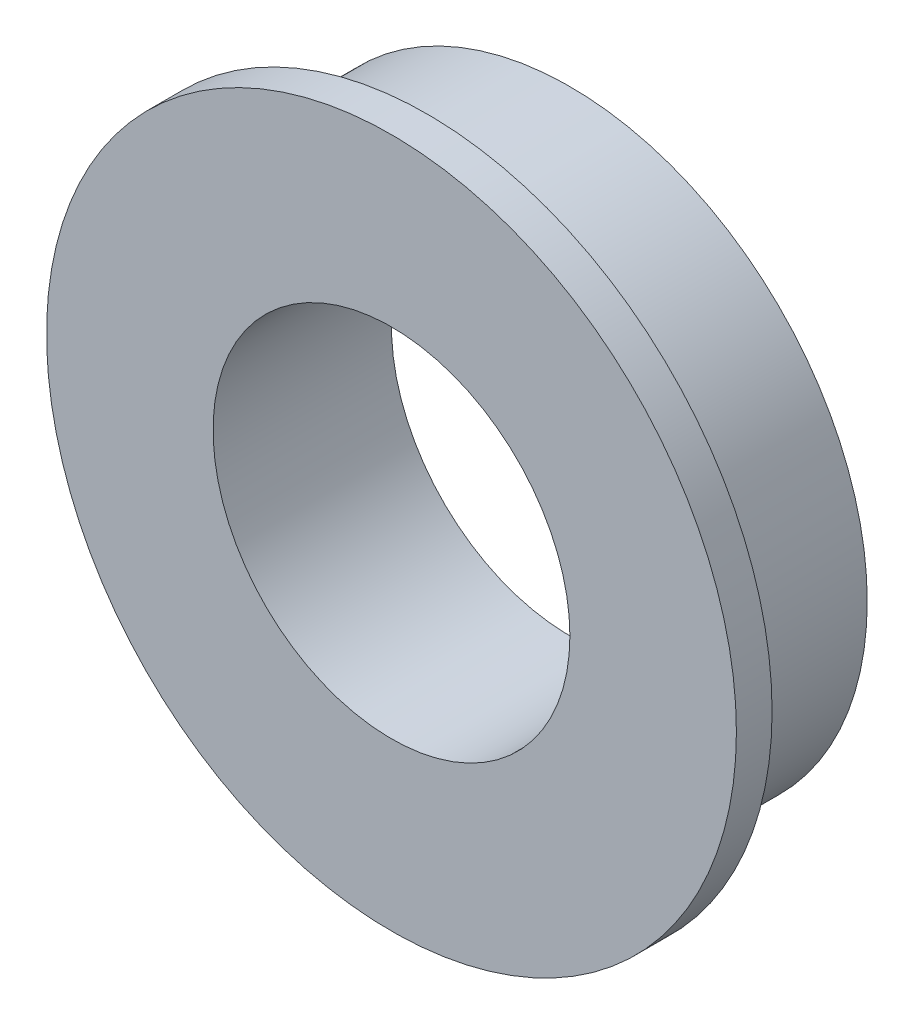
ISO-10303-21;
HEADER;
FILE_DESCRIPTION(('STEP AP214'),'2;1');
FILE_NAME('part.step','',(''),(''),'','','');
FILE_SCHEMA(('AUTOMOTIVE_DESIGN { 1 0 10303 214 1 1 1 1 }'));
ENDSEC;
DATA;
#1=APPLICATION_CONTEXT('core data for automotive mechanical design processes');
#2=APPLICATION_PROTOCOL_DEFINITION('international standard','automotive_design',2000,#1);
#3=PRODUCT_CONTEXT('',#1,'mechanical');
#4=PRODUCT('Part','Part','',(#3));
#5=PRODUCT_RELATED_PRODUCT_CATEGORY('part','',(#4));
#6=PRODUCT_DEFINITION_FORMATION('','',#4);
#7=PRODUCT_DEFINITION_CONTEXT('part definition',#1,'design');
#8=PRODUCT_DEFINITION('design','',#6,#7);
#9=PRODUCT_DEFINITION_SHAPE('','',#8);
#10=(LENGTH_UNIT() NAMED_UNIT(*) SI_UNIT(.MILLI.,.METRE.));
#11=(NAMED_UNIT(*) PLANE_ANGLE_UNIT() SI_UNIT($,.RADIAN.));
#12=(NAMED_UNIT(*) SI_UNIT($,.STERADIAN.) SOLID_ANGLE_UNIT());
#13=UNCERTAINTY_MEASURE_WITH_UNIT(LENGTH_MEASURE(1.E-05),#10,'distance_accuracy_value','');
#14=(GEOMETRIC_REPRESENTATION_CONTEXT(3) GLOBAL_UNCERTAINTY_ASSIGNED_CONTEXT((#13)) GLOBAL_UNIT_ASSIGNED_CONTEXT((#10,
#11,#12)) REPRESENTATION_CONTEXT('',''));
#15=CARTESIAN_POINT('',(0.,0.,0.));
#16=DIRECTION('',(0.,0.,1.));
#17=DIRECTION('',(1.,0.,0.));
#18=AXIS2_PLACEMENT_3D('',#15,#16,#17);
#19=CARTESIAN_POINT('',(0.,0.,3.));
#20=DIRECTION('',(0.,0.,-1.));
#21=DIRECTION('',(-1.,0.,0.));
#22=AXIS2_PLACEMENT_3D('',#19,#20,#21);
#23=CYLINDRICAL_SURFACE('',#22,5.);
#24=CARTESIAN_POINT('',(0.,0.,3.));
#25=DIRECTION('',(0.,0.,1.));
#26=DIRECTION('',(1.,0.,0.));
#27=AXIS2_PLACEMENT_3D('',#24,#25,#26);
#28=CIRCLE('',#27,5.);
#29=CARTESIAN_POINT('',(5.,0.,3.));
#30=VERTEX_POINT('',#29);
#31=EDGE_CURVE('E11',#30,#30,#28,.T.);
#32=ORIENTED_EDGE('',*,*,#31,.F.);
#33=EDGE_LOOP('',(#32));
#34=FACE_BOUND('',#33,.T.);
#35=CARTESIAN_POINT('',(0.,0.,0.6));
#36=DIRECTION('',(0.,0.,1.));
#37=DIRECTION('',(1.,0.,0.));
#38=AXIS2_PLACEMENT_3D('',#35,#36,#37);
#39=CIRCLE('',#38,5.);
#40=CARTESIAN_POINT('',(5.,0.,0.6));
#41=VERTEX_POINT('',#40);
#42=EDGE_CURVE('E19',#41,#41,#39,.T.);
#43=ORIENTED_EDGE('',*,*,#42,.T.);
#44=EDGE_LOOP('',(#43));
#45=FACE_BOUND('',#44,.T.);
#46=ADVANCED_FACE('F16',(#34,#45),#23,.T.);
#47=CARTESIAN_POINT('',(0.,0.,0.6));
#48=DIRECTION('',(0.,0.,1.));
#49=DIRECTION('',(1.,0.,0.));
#50=AXIS2_PLACEMENT_3D('',#47,#48,#49);
#51=PLANE('',#50);
#52=CARTESIAN_POINT('',(0.,0.,0.6));
#53=DIRECTION('',(0.,0.,1.));
#54=DIRECTION('',(1.,0.,0.));
#55=AXIS2_PLACEMENT_3D('',#52,#53,#54);
#56=CIRCLE('',#55,3.);
#57=CARTESIAN_POINT('',(3.,0.,0.6));
#58=VERTEX_POINT('',#57);
#59=EDGE_CURVE('E55',#58,#58,#56,.F.);
#60=ORIENTED_EDGE('',*,*,#59,.F.);
#61=EDGE_LOOP('',(#60));
#62=FACE_BOUND('',#61,.T.);
#63=ORIENTED_EDGE('',*,*,#42,.F.);
#64=EDGE_LOOP('',(#63));
#65=FACE_BOUND('',#64,.T.);
#66=ADVANCED_FACE('F77',(#62,#65),#51,.F.);
#67=CARTESIAN_POINT('',(0.,0.,3.6));
#68=DIRECTION('',(0.,0.,-1.));
#69=DIRECTION('',(-1.,0.,0.));
#70=AXIS2_PLACEMENT_3D('',#67,#68,#69);
#71=CYLINDRICAL_SURFACE('',#70,5.8);
#72=CARTESIAN_POINT('',(0.,0.,3.6));
#73=DIRECTION('',(0.,0.,1.));
#74=DIRECTION('',(1.,0.,0.));
#75=AXIS2_PLACEMENT_3D('',#72,#73,#74);
#76=CIRCLE('',#75,5.8);
#77=CARTESIAN_POINT('',(5.8,0.,3.6));
#78=VERTEX_POINT('',#77);
#79=EDGE_CURVE('E38',#78,#78,#76,.T.);
#80=ORIENTED_EDGE('',*,*,#79,.F.);
#81=EDGE_LOOP('',(#80));
#82=FACE_BOUND('',#81,.T.);
#83=CARTESIAN_POINT('',(0.,0.,3.));
#84=DIRECTION('',(0.,0.,1.));
#85=DIRECTION('',(1.,0.,0.));
#86=AXIS2_PLACEMENT_3D('',#83,#84,#85);
#87=CIRCLE('',#86,5.8);
#88=CARTESIAN_POINT('',(5.8,0.,3.));
#89=VERTEX_POINT('',#88);
#90=EDGE_CURVE('E32',#89,#89,#87,.T.);
#91=ORIENTED_EDGE('',*,*,#90,.T.);
#92=EDGE_LOOP('',(#91));
#93=FACE_BOUND('',#92,.T.);
#94=ADVANCED_FACE('F80',(#82,#93),#71,.T.);
#95=CARTESIAN_POINT('',(0.,0.,3.6));
#96=DIRECTION('',(0.,0.,1.));
#97=DIRECTION('',(1.,0.,0.));
#98=AXIS2_PLACEMENT_3D('',#95,#96,#97);
#99=PLANE('',#98);
#100=CARTESIAN_POINT('',(0.,0.,3.6));
#101=DIRECTION('',(0.,0.,-1.));
#102=DIRECTION('',(1.,0.,0.));
#103=AXIS2_PLACEMENT_3D('',#100,#101,#102);
#104=CIRCLE('',#103,3.);
#105=CARTESIAN_POINT('',(3.,0.,3.6));
#106=VERTEX_POINT('',#105);
#107=EDGE_CURVE('E59',#106,#106,#104,.T.);
#108=ORIENTED_EDGE('',*,*,#107,.T.);
#109=EDGE_LOOP('',(#108));
#110=FACE_BOUND('',#109,.T.);
#111=ORIENTED_EDGE('',*,*,#79,.T.);
#112=EDGE_LOOP('',(#111));
#113=FACE_BOUND('',#112,.T.);
#114=ADVANCED_FACE('F86',(#110,#113),#99,.T.);
#115=CARTESIAN_POINT('',(0.,0.,3.));
#116=DIRECTION('',(0.,0.,1.));
#117=DIRECTION('',(1.,0.,0.));
#118=AXIS2_PLACEMENT_3D('',#115,#116,#117);
#119=PLANE('',#118);
#120=ORIENTED_EDGE('',*,*,#31,.T.);
#121=EDGE_LOOP('',(#120));
#122=FACE_BOUND('',#121,.T.);
#123=ORIENTED_EDGE('',*,*,#90,.F.);
#124=EDGE_LOOP('',(#123));
#125=FACE_BOUND('',#124,.T.);
#126=ADVANCED_FACE('F91',(#122,#125),#119,.F.);
#127=CARTESIAN_POINT('',(0.,0.,-1.40000000000002));
#128=DIRECTION('',(0.,0.,1.));
#129=DIRECTION('',(-1.,0.,0.));
#130=AXIS2_PLACEMENT_3D('',#127,#128,#129);
#131=CYLINDRICAL_SURFACE('',#130,3.);
#132=ORIENTED_EDGE('',*,*,#107,.F.);
#133=EDGE_LOOP('',(#132));
#134=FACE_BOUND('',#133,.T.);
#135=ORIENTED_EDGE('',*,*,#59,.T.);
#136=EDGE_LOOP('',(#135));
#137=FACE_BOUND('',#136,.T.);
#138=ADVANCED_FACE('F56',(#134,#137),#131,.F.);
#139=CLOSED_SHELL('',(#46,#66,#94,#114,#126,#138));
#140=MANIFOLD_SOLID_BREP('B1',#139);
#141=ADVANCED_BREP_SHAPE_REPRESENTATION('',(#18,#140),#14);
#142=SHAPE_DEFINITION_REPRESENTATION(#9,#141);
ENDSEC;
END-ISO-10303-21;
